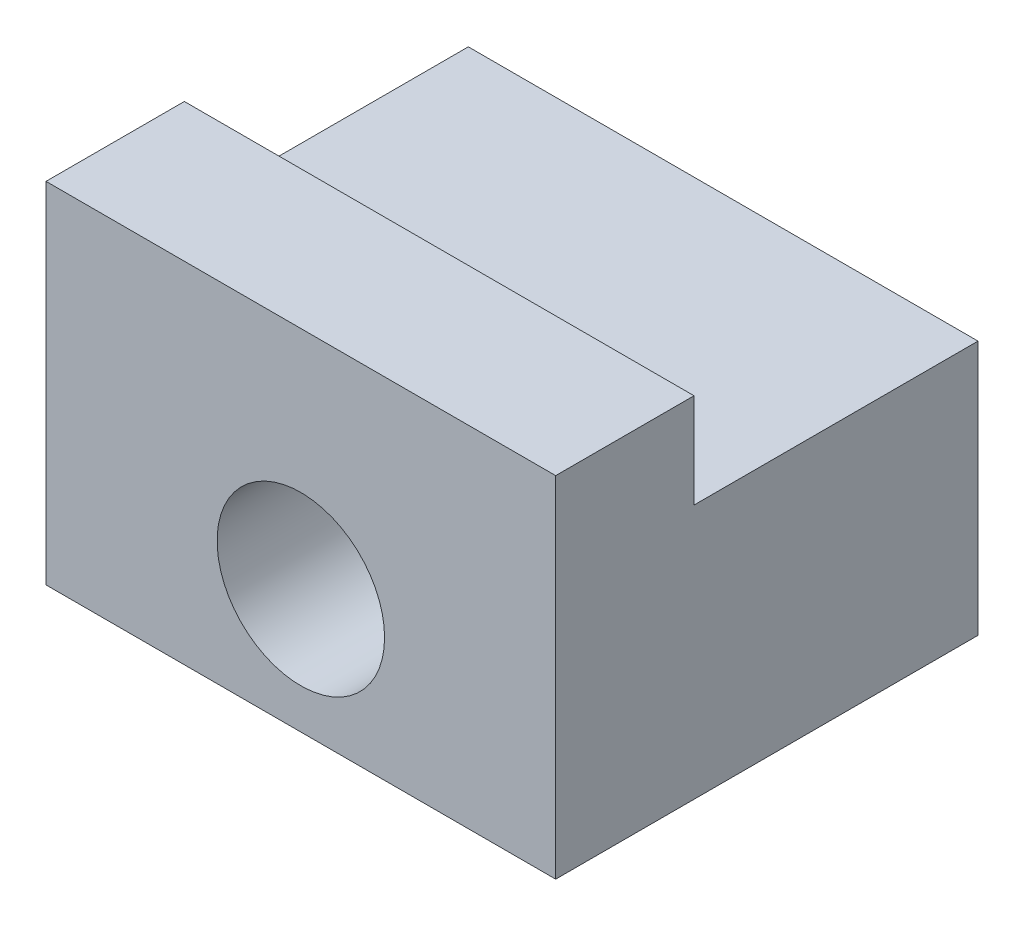
ISO-10303-21;
HEADER;
FILE_DESCRIPTION(('STEP AP214'),'2;1');
FILE_NAME('part.step','',(''),(''),'','','');
FILE_SCHEMA(('AUTOMOTIVE_DESIGN { 1 0 10303 214 1 1 1 1 }'));
ENDSEC;
DATA;
#1=APPLICATION_CONTEXT('core data for automotive mechanical design processes');
#2=APPLICATION_PROTOCOL_DEFINITION('international standard','automotive_design',2000,#1);
#3=PRODUCT_CONTEXT('',#1,'mechanical');
#4=PRODUCT('Part','Part','',(#3));
#5=PRODUCT_RELATED_PRODUCT_CATEGORY('part','',(#4));
#6=PRODUCT_DEFINITION_FORMATION('','',#4);
#7=PRODUCT_DEFINITION_CONTEXT('part definition',#1,'design');
#8=PRODUCT_DEFINITION('design','',#6,#7);
#9=PRODUCT_DEFINITION_SHAPE('','',#8);
#10=(LENGTH_UNIT() NAMED_UNIT(*) SI_UNIT(.MILLI.,.METRE.));
#11=(NAMED_UNIT(*) PLANE_ANGLE_UNIT() SI_UNIT($,.RADIAN.));
#12=(NAMED_UNIT(*) SI_UNIT($,.STERADIAN.) SOLID_ANGLE_UNIT());
#13=UNCERTAINTY_MEASURE_WITH_UNIT(LENGTH_MEASURE(1.E-05),#10,'distance_accuracy_value','');
#14=(GEOMETRIC_REPRESENTATION_CONTEXT(3) GLOBAL_UNCERTAINTY_ASSIGNED_CONTEXT((#13)) GLOBAL_UNIT_ASSIGNED_CONTEXT((#10,
#11,#12)) REPRESENTATION_CONTEXT('',''));
#15=CARTESIAN_POINT('',(0.,0.,0.));
#16=DIRECTION('',(0.,0.,1.));
#17=DIRECTION('',(1.,0.,0.));
#18=AXIS2_PLACEMENT_3D('',#15,#16,#17);
#19=CARTESIAN_POINT('',(0.,0.,5.8));
#20=DIRECTION('',(0.,0.,1.));
#21=DIRECTION('',(1.,0.,0.));
#22=AXIS2_PLACEMENT_3D('',#19,#20,#21);
#23=PLANE('',#22);
#24=DIRECTION('',(0.,-1.,0.));
#25=VECTOR('',#24,1.);
#26=CARTESIAN_POINT('',(-3.5,1.8,5.8));
#27=LINE('',#26,#25);
#28=CARTESIAN_POINT('',(-3.5,3.1,5.8));
#29=VERTEX_POINT('',#28);
#30=CARTESIAN_POINT('',(-3.5,-1.7,5.8));
#31=VERTEX_POINT('',#30);
#32=EDGE_CURVE('E107',#29,#31,#27,.T.);
#33=ORIENTED_EDGE('',*,*,#32,.T.);
#34=DIRECTION('',(1.,0.,0.));
#35=VECTOR('',#34,1.);
#36=CARTESIAN_POINT('',(-3.5,-1.7,5.8));
#37=LINE('',#36,#35);
#38=CARTESIAN_POINT('',(3.5,-1.7,5.8));
#39=VERTEX_POINT('',#38);
#40=EDGE_CURVE('E67',#31,#39,#37,.T.);
#41=ORIENTED_EDGE('',*,*,#40,.T.);
#42=DIRECTION('',(0.,1.,0.));
#43=VECTOR('',#42,1.);
#44=CARTESIAN_POINT('',(3.5,-1.7,5.8));
#45=LINE('',#44,#43);
#46=CARTESIAN_POINT('',(3.5,3.1,5.8));
#47=VERTEX_POINT('',#46);
#48=EDGE_CURVE('E98',#39,#47,#45,.T.);
#49=ORIENTED_EDGE('',*,*,#48,.T.);
#50=DIRECTION('',(-1.,0.,0.));
#51=VECTOR('',#50,1.);
#52=CARTESIAN_POINT('',(3.5,3.1,5.8));
#53=LINE('',#52,#51);
#54=EDGE_CURVE('E139',#47,#29,#53,.T.);
#55=ORIENTED_EDGE('',*,*,#54,.T.);
#56=EDGE_LOOP('',(#33,#41,#49,#55));
#57=FACE_BOUND('',#56,.T.);
#58=CARTESIAN_POINT('',(0.,0.,5.8));
#59=DIRECTION('',(0.,0.,1.));
#60=DIRECTION('',(1.,0.,0.));
#61=AXIS2_PLACEMENT_3D('',#58,#59,#60);
#62=CIRCLE('',#61,1.15);
#63=CARTESIAN_POINT('',(1.15,0.,5.8));
#64=VERTEX_POINT('',#63);
#65=EDGE_CURVE('E113',#64,#64,#62,.T.);
#66=ORIENTED_EDGE('',*,*,#65,.F.);
#67=EDGE_LOOP('',(#66));
#68=FACE_BOUND('',#67,.T.);
#69=ADVANCED_FACE('F43',(#57,#68),#23,.T.);
#70=CARTESIAN_POINT('',(0.,0.,0.));
#71=DIRECTION('',(0.,0.,1.));
#72=DIRECTION('',(1.,0.,0.));
#73=AXIS2_PLACEMENT_3D('',#70,#71,#72);
#74=PLANE('',#73);
#75=DIRECTION('',(0.,-1.,0.));
#76=VECTOR('',#75,1.);
#77=CARTESIAN_POINT('',(-3.5,1.8,0.));
#78=LINE('',#77,#76);
#79=CARTESIAN_POINT('',(-3.5,1.8,0.));
#80=VERTEX_POINT('',#79);
#81=CARTESIAN_POINT('',(-3.5,-1.7,0.));
#82=VERTEX_POINT('',#81);
#83=EDGE_CURVE('E91',#80,#82,#78,.T.);
#84=ORIENTED_EDGE('',*,*,#83,.F.);
#85=DIRECTION('',(-1.,0.,0.));
#86=VECTOR('',#85,1.);
#87=CARTESIAN_POINT('',(3.5,1.8,0.));
#88=LINE('',#87,#86);
#89=CARTESIAN_POINT('',(3.5,1.8,0.));
#90=VERTEX_POINT('',#89);
#91=EDGE_CURVE('E101',#90,#80,#88,.T.);
#92=ORIENTED_EDGE('',*,*,#91,.F.);
#93=DIRECTION('',(0.,1.,0.));
#94=VECTOR('',#93,1.);
#95=CARTESIAN_POINT('',(3.5,-1.7,0.));
#96=LINE('',#95,#94);
#97=CARTESIAN_POINT('',(3.5,-1.7,0.));
#98=VERTEX_POINT('',#97);
#99=EDGE_CURVE('E108',#98,#90,#96,.T.);
#100=ORIENTED_EDGE('',*,*,#99,.F.);
#101=DIRECTION('',(1.,0.,0.));
#102=VECTOR('',#101,1.);
#103=CARTESIAN_POINT('',(-3.5,-1.7,0.));
#104=LINE('',#103,#102);
#105=EDGE_CURVE('E112',#82,#98,#104,.T.);
#106=ORIENTED_EDGE('',*,*,#105,.F.);
#107=EDGE_LOOP('',(#84,#92,#100,#106));
#108=FACE_BOUND('',#107,.T.);
#109=CARTESIAN_POINT('',(0.,0.,0.));
#110=DIRECTION('',(0.,0.,1.));
#111=DIRECTION('',(1.,0.,0.));
#112=AXIS2_PLACEMENT_3D('',#109,#110,#111);
#113=CIRCLE('',#112,1.15);
#114=CARTESIAN_POINT('',(1.15,0.,0.));
#115=VERTEX_POINT('',#114);
#116=EDGE_CURVE('E117',#115,#115,#113,.T.);
#117=ORIENTED_EDGE('',*,*,#116,.T.);
#118=EDGE_LOOP('',(#117));
#119=FACE_BOUND('',#118,.T.);
#120=ADVANCED_FACE('F110',(#108,#119),#74,.F.);
#121=CARTESIAN_POINT('',(-3.5,1.8,5.8));
#122=DIRECTION('',(1.,0.,0.));
#123=DIRECTION('',(0.,0.,-1.));
#124=AXIS2_PLACEMENT_3D('',#121,#122,#123);
#125=PLANE('',#124);
#126=ORIENTED_EDGE('',*,*,#83,.T.);
#127=DIRECTION('',(0.,0.,-1.));
#128=VECTOR('',#127,1.);
#129=CARTESIAN_POINT('',(-3.5,-1.7,5.8));
#130=LINE('',#129,#128);
#131=EDGE_CURVE('E11',#31,#82,#130,.T.);
#132=ORIENTED_EDGE('',*,*,#131,.F.);
#133=ORIENTED_EDGE('',*,*,#32,.F.);
#134=DIRECTION('',(0.,0.,-1.));
#135=VECTOR('',#134,1.);
#136=CARTESIAN_POINT('',(-3.5,3.1,5.8));
#137=LINE('',#136,#135);
#138=CARTESIAN_POINT('',(-3.5,3.1,3.9));
#139=VERTEX_POINT('',#138);
#140=EDGE_CURVE('E134',#29,#139,#137,.T.);
#141=ORIENTED_EDGE('',*,*,#140,.T.);
#142=DIRECTION('',(0.,-1.,0.));
#143=VECTOR('',#142,1.);
#144=CARTESIAN_POINT('',(-3.5,3.1,3.9));
#145=LINE('',#144,#143);
#146=CARTESIAN_POINT('',(-3.5,1.8,3.9));
#147=VERTEX_POINT('',#146);
#148=EDGE_CURVE('E95',#139,#147,#145,.T.);
#149=ORIENTED_EDGE('',*,*,#148,.T.);
#150=DIRECTION('',(0.,0.,-1.));
#151=VECTOR('',#150,1.);
#152=CARTESIAN_POINT('',(-3.5,1.8,5.8));
#153=LINE('',#152,#151);
#154=EDGE_CURVE('E87',#147,#80,#153,.T.);
#155=ORIENTED_EDGE('',*,*,#154,.T.);
#156=EDGE_LOOP('',(#126,#132,#133,#141,#149,#155));
#157=FACE_BOUND('',#156,.T.);
#158=ADVANCED_FACE('F45',(#157),#125,.F.);
#159=CARTESIAN_POINT('',(-3.5,-1.7,5.8));
#160=DIRECTION('',(0.,1.,0.));
#161=DIRECTION('',(0.,0.,1.));
#162=AXIS2_PLACEMENT_3D('',#159,#160,#161);
#163=PLANE('',#162);
#164=ORIENTED_EDGE('',*,*,#105,.T.);
#165=DIRECTION('',(0.,0.,-1.));
#166=VECTOR('',#165,1.);
#167=CARTESIAN_POINT('',(3.5,-1.7,5.8));
#168=LINE('',#167,#166);
#169=EDGE_CURVE('E51',#39,#98,#168,.T.);
#170=ORIENTED_EDGE('',*,*,#169,.F.);
#171=ORIENTED_EDGE('',*,*,#40,.F.);
#172=ORIENTED_EDGE('',*,*,#131,.T.);
#173=EDGE_LOOP('',(#164,#170,#171,#172));
#174=FACE_BOUND('',#173,.T.);
#175=ADVANCED_FACE('F129',(#174),#163,.F.);
#176=CARTESIAN_POINT('',(3.5,-1.7,5.8));
#177=DIRECTION('',(-1.,0.,0.));
#178=DIRECTION('',(0.,0.,1.));
#179=AXIS2_PLACEMENT_3D('',#176,#177,#178);
#180=PLANE('',#179);
#181=ORIENTED_EDGE('',*,*,#99,.T.);
#182=DIRECTION('',(0.,0.,-1.));
#183=VECTOR('',#182,1.);
#184=CARTESIAN_POINT('',(3.5,1.8,5.8));
#185=LINE('',#184,#183);
#186=CARTESIAN_POINT('',(3.5,1.8,3.9));
#187=VERTEX_POINT('',#186);
#188=EDGE_CURVE('E97',#187,#90,#185,.T.);
#189=ORIENTED_EDGE('',*,*,#188,.F.);
#190=DIRECTION('',(0.,1.,0.));
#191=VECTOR('',#190,1.);
#192=CARTESIAN_POINT('',(3.5,1.8,3.9));
#193=LINE('',#192,#191);
#194=CARTESIAN_POINT('',(3.5,3.1,3.9));
#195=VERTEX_POINT('',#194);
#196=EDGE_CURVE('E58',#187,#195,#193,.T.);
#197=ORIENTED_EDGE('',*,*,#196,.T.);
#198=DIRECTION('',(0.,0.,-1.));
#199=VECTOR('',#198,1.);
#200=CARTESIAN_POINT('',(3.5,3.1,5.8));
#201=LINE('',#200,#199);
#202=EDGE_CURVE('E147',#47,#195,#201,.T.);
#203=ORIENTED_EDGE('',*,*,#202,.F.);
#204=ORIENTED_EDGE('',*,*,#48,.F.);
#205=ORIENTED_EDGE('',*,*,#169,.T.);
#206=EDGE_LOOP('',(#181,#189,#197,#203,#204,#205));
#207=FACE_BOUND('',#206,.T.);
#208=ADVANCED_FACE('F126',(#207),#180,.F.);
#209=CARTESIAN_POINT('',(3.5,1.8,5.8));
#210=DIRECTION('',(0.,-1.,0.));
#211=DIRECTION('',(0.,0.,-1.));
#212=AXIS2_PLACEMENT_3D('',#209,#210,#211);
#213=PLANE('',#212);
#214=ORIENTED_EDGE('',*,*,#154,.F.);
#215=DIRECTION('',(1.,0.,0.));
#216=VECTOR('',#215,1.);
#217=CARTESIAN_POINT('',(-3.5,1.8,3.9));
#218=LINE('',#217,#216);
#219=EDGE_CURVE('E239',#147,#187,#218,.T.);
#220=ORIENTED_EDGE('',*,*,#219,.T.);
#221=ORIENTED_EDGE('',*,*,#188,.T.);
#222=ORIENTED_EDGE('',*,*,#91,.T.);
#223=EDGE_LOOP('',(#214,#220,#221,#222));
#224=FACE_BOUND('',#223,.T.);
#225=ADVANCED_FACE('F102',(#224),#213,.F.);
#226=CARTESIAN_POINT('',(0.,0.,5.8));
#227=DIRECTION('',(0.,0.,-1.));
#228=DIRECTION('',(-1.,0.,0.));
#229=AXIS2_PLACEMENT_3D('',#226,#227,#228);
#230=CYLINDRICAL_SURFACE('',#229,1.15);
#231=ORIENTED_EDGE('',*,*,#65,.T.);
#232=EDGE_LOOP('',(#231));
#233=FACE_BOUND('',#232,.T.);
#234=ORIENTED_EDGE('',*,*,#116,.F.);
#235=EDGE_LOOP('',(#234));
#236=FACE_BOUND('',#235,.T.);
#237=ADVANCED_FACE('F156',(#233,#236),#230,.F.);
#238=CARTESIAN_POINT('',(3.5,3.1,5.8));
#239=DIRECTION('',(0.,-1.,0.));
#240=DIRECTION('',(0.,0.,-1.));
#241=AXIS2_PLACEMENT_3D('',#238,#239,#240);
#242=PLANE('',#241);
#243=DIRECTION('',(-1.,0.,0.));
#244=VECTOR('',#243,1.);
#245=CARTESIAN_POINT('',(3.5,3.1,3.9));
#246=LINE('',#245,#244);
#247=EDGE_CURVE('E143',#195,#139,#246,.T.);
#248=ORIENTED_EDGE('',*,*,#247,.T.);
#249=ORIENTED_EDGE('',*,*,#140,.F.);
#250=ORIENTED_EDGE('',*,*,#54,.F.);
#251=ORIENTED_EDGE('',*,*,#202,.T.);
#252=EDGE_LOOP('',(#248,#249,#250,#251));
#253=FACE_BOUND('',#252,.T.);
#254=ADVANCED_FACE('F146',(#253),#242,.F.);
#255=CARTESIAN_POINT('',(0.,0.,3.9));
#256=DIRECTION('',(0.,0.,1.));
#257=DIRECTION('',(1.,0.,0.));
#258=AXIS2_PLACEMENT_3D('',#255,#256,#257);
#259=PLANE('',#258);
#260=ORIENTED_EDGE('',*,*,#148,.F.);
#261=ORIENTED_EDGE('',*,*,#247,.F.);
#262=ORIENTED_EDGE('',*,*,#196,.F.);
#263=ORIENTED_EDGE('',*,*,#219,.F.);
#264=EDGE_LOOP('',(#260,#261,#262,#263));
#265=FACE_BOUND('',#264,.T.);
#266=ADVANCED_FACE('F165',(#265),#259,.F.);
#267=CLOSED_SHELL('',(#69,#120,#158,#175,#208,#225,#237,#254,#266));
#268=MANIFOLD_SOLID_BREP('B2',#267);
#269=ADVANCED_BREP_SHAPE_REPRESENTATION('',(#18,#268),#14);
#270=SHAPE_DEFINITION_REPRESENTATION(#9,#269);
ENDSEC;
END-ISO-10303-21;
